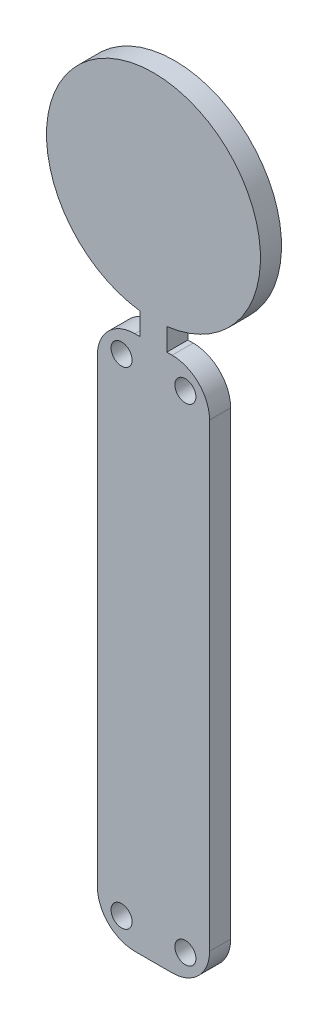
ISO-10303-21;
HEADER;
FILE_DESCRIPTION(('STEP AP214'),'2;1');
FILE_NAME('part.step','',(''),(''),'','','');
FILE_SCHEMA(('AUTOMOTIVE_DESIGN { 1 0 10303 214 1 1 1 1 }'));
ENDSEC;
DATA;
#1=APPLICATION_CONTEXT('core data for automotive mechanical design processes');
#2=APPLICATION_PROTOCOL_DEFINITION('international standard','automotive_design',2000,#1);
#3=PRODUCT_CONTEXT('',#1,'mechanical');
#4=PRODUCT('Part','Part','',(#3));
#5=PRODUCT_RELATED_PRODUCT_CATEGORY('part','',(#4));
#6=PRODUCT_DEFINITION_FORMATION('','',#4);
#7=PRODUCT_DEFINITION_CONTEXT('part definition',#1,'design');
#8=PRODUCT_DEFINITION('design','',#6,#7);
#9=PRODUCT_DEFINITION_SHAPE('','',#8);
#10=(LENGTH_UNIT() NAMED_UNIT(*) SI_UNIT(.MILLI.,.METRE.));
#11=(NAMED_UNIT(*) PLANE_ANGLE_UNIT() SI_UNIT($,.RADIAN.));
#12=(NAMED_UNIT(*) SI_UNIT($,.STERADIAN.) SOLID_ANGLE_UNIT());
#13=UNCERTAINTY_MEASURE_WITH_UNIT(LENGTH_MEASURE(1.E-05),#10,'distance_accuracy_value','');
#14=(GEOMETRIC_REPRESENTATION_CONTEXT(3) GLOBAL_UNCERTAINTY_ASSIGNED_CONTEXT((#13)) GLOBAL_UNIT_ASSIGNED_CONTEXT((#10,
#11,#12)) REPRESENTATION_CONTEXT('',''));
#15=CARTESIAN_POINT('',(0.,0.,0.));
#16=DIRECTION('',(0.,0.,1.));
#17=DIRECTION('',(1.,0.,0.));
#18=AXIS2_PLACEMENT_3D('',#15,#16,#17);
#19=CARTESIAN_POINT('',(-6.75698468233734,40.9643343229392,0.25));
#20=DIRECTION('',(0.,0.,-1.));
#21=DIRECTION('',(-1.,0.,0.));
#22=AXIS2_PLACEMENT_3D('',#19,#20,#21);
#23=CYLINDRICAL_SURFACE('',#22,2.53999999999997);
#24=CARTESIAN_POINT('',(-6.75698468233734,40.9643343229392,-0.25));
#25=DIRECTION('',(0.,0.,1.));
#26=DIRECTION('',(1.,0.,0.));
#27=AXIS2_PLACEMENT_3D('',#24,#25,#26);
#28=CIRCLE('',#27,2.53999999999997);
#29=CARTESIAN_POINT('',(-6.43948468233734,38.4442561991502,-0.25));
#30=VERTEX_POINT('',#29);
#31=CARTESIAN_POINT('',(-7.07448468233734,38.4442561991502,-0.25));
#32=VERTEX_POINT('',#31);
#33=EDGE_CURVE('E155',#30,#32,#28,.T.);
#34=ORIENTED_EDGE('',*,*,#33,.T.);
#35=DIRECTION('',(0.,0.,-1.));
#36=VECTOR('',#35,1.);
#37=CARTESIAN_POINT('',(-7.07448468233734,38.4442561991502,0.25));
#38=LINE('',#37,#36);
#39=CARTESIAN_POINT('',(-7.07448468233734,38.4442561991502,0.25));
#40=VERTEX_POINT('',#39);
#41=EDGE_CURVE('E11',#40,#32,#38,.T.);
#42=ORIENTED_EDGE('',*,*,#41,.F.);
#43=CARTESIAN_POINT('',(-6.75698468233734,40.9643343229392,0.25));
#44=DIRECTION('',(0.,0.,1.));
#45=DIRECTION('',(1.,0.,0.));
#46=AXIS2_PLACEMENT_3D('',#43,#44,#45);
#47=CIRCLE('',#46,2.53999999999997);
#48=CARTESIAN_POINT('',(-6.43948468233734,38.4442561991502,0.25));
#49=VERTEX_POINT('',#48);
#50=EDGE_CURVE('E177',#49,#40,#47,.T.);
#51=ORIENTED_EDGE('',*,*,#50,.F.);
#52=DIRECTION('',(0.,0.,-1.));
#53=VECTOR('',#52,1.);
#54=CARTESIAN_POINT('',(-6.43948468233734,38.4442561991502,0.25));
#55=LINE('',#54,#53);
#56=EDGE_CURVE('E151',#49,#30,#55,.T.);
#57=ORIENTED_EDGE('',*,*,#56,.T.);
#58=EDGE_LOOP('',(#34,#42,#51,#57));
#59=FACE_BOUND('',#58,.T.);
#60=ADVANCED_FACE('F33',(#59),#23,.T.);
#61=CARTESIAN_POINT('',(-7.07448468233734,38.4442561991502,0.25));
#62=DIRECTION('',(1.,0.,0.));
#63=DIRECTION('',(0.,0.,-1.));
#64=AXIS2_PLACEMENT_3D('',#61,#62,#63);
#65=PLANE('',#64);
#66=DIRECTION('',(0.,-1.,0.));
#67=VECTOR('',#66,1.);
#68=CARTESIAN_POINT('',(-7.07448468233734,38.4442561991502,-0.25));
#69=LINE('',#68,#67);
#70=CARTESIAN_POINT('',(-7.07448468233734,37.9163343229392,-0.25));
#71=VERTEX_POINT('',#70);
#72=EDGE_CURVE('E158',#32,#71,#69,.T.);
#73=ORIENTED_EDGE('',*,*,#72,.T.);
#74=DIRECTION('',(0.,0.,-1.));
#75=VECTOR('',#74,1.);
#76=CARTESIAN_POINT('',(-7.07448468233734,37.9163343229392,0.25));
#77=LINE('',#76,#75);
#78=CARTESIAN_POINT('',(-7.07448468233734,37.9163343229392,0.25));
#79=VERTEX_POINT('',#78);
#80=EDGE_CURVE('E42',#79,#71,#77,.T.);
#81=ORIENTED_EDGE('',*,*,#80,.F.);
#82=DIRECTION('',(0.,-1.,0.));
#83=VECTOR('',#82,1.);
#84=CARTESIAN_POINT('',(-7.07448468233734,38.4442561991502,0.25));
#85=LINE('',#84,#83);
#86=EDGE_CURVE('E106',#40,#79,#85,.T.);
#87=ORIENTED_EDGE('',*,*,#86,.F.);
#88=ORIENTED_EDGE('',*,*,#41,.T.);
#89=EDGE_LOOP('',(#73,#81,#87,#88));
#90=FACE_BOUND('',#89,.T.);
#91=ADVANCED_FACE('F230',(#90),#65,.F.);
#92=CARTESIAN_POINT('',(-7.07448468233734,37.9163343229392,0.25));
#93=DIRECTION('',(0.,-1.,0.));
#94=DIRECTION('',(0.,0.,-1.));
#95=AXIS2_PLACEMENT_3D('',#92,#93,#94);
#96=PLANE('',#95);
#97=DIRECTION('',(-1.,0.,0.));
#98=VECTOR('',#97,1.);
#99=CARTESIAN_POINT('',(-7.07448468233734,37.9163343229392,-0.25));
#100=LINE('',#99,#98);
#101=CARTESIAN_POINT('',(-7.20013304927737,37.9163343229392,-0.25));
#102=VERTEX_POINT('',#101);
#103=EDGE_CURVE('E160',#71,#102,#100,.T.);
#104=ORIENTED_EDGE('',*,*,#103,.T.);
#105=DIRECTION('',(0.,0.,-1.));
#106=VECTOR('',#105,1.);
#107=CARTESIAN_POINT('',(-7.20013304927737,37.9163343229392,0.25));
#108=LINE('',#107,#106);
#109=CARTESIAN_POINT('',(-7.20013304927737,37.9163343229392,0.25));
#110=VERTEX_POINT('',#109);
#111=EDGE_CURVE('E196',#110,#102,#108,.T.);
#112=ORIENTED_EDGE('',*,*,#111,.F.);
#113=DIRECTION('',(-1.,0.,0.));
#114=VECTOR('',#113,1.);
#115=CARTESIAN_POINT('',(-7.07448468233734,37.9163343229392,0.25));
#116=LINE('',#115,#114);
#117=EDGE_CURVE('E245',#79,#110,#116,.T.);
#118=ORIENTED_EDGE('',*,*,#117,.F.);
#119=ORIENTED_EDGE('',*,*,#80,.T.);
#120=EDGE_LOOP('',(#104,#112,#118,#119));
#121=FACE_BOUND('',#120,.T.);
#122=ADVANCED_FACE('F235',(#121),#96,.F.);
#123=CARTESIAN_POINT('',(-7.20013304927737,37.0273343229392,0.25));
#124=DIRECTION('',(0.,0.,-1.));
#125=DIRECTION('',(-1.,0.,0.));
#126=AXIS2_PLACEMENT_3D('',#123,#124,#125);
#127=CYLINDRICAL_SURFACE('',#126,0.889000000000001);
#128=CARTESIAN_POINT('',(-7.20013304927737,37.0273343229392,-0.25));
#129=DIRECTION('',(0.,0.,1.));
#130=DIRECTION('',(1.,0.,0.));
#131=AXIS2_PLACEMENT_3D('',#128,#129,#130);
#132=CIRCLE('',#131,0.889000000000001);
#133=CARTESIAN_POINT('',(-8.08913304927737,37.0273343229392,-0.25));
#134=VERTEX_POINT('',#133);
#135=EDGE_CURVE('E162',#102,#134,#132,.T.);
#136=ORIENTED_EDGE('',*,*,#135,.T.);
#137=DIRECTION('',(0.,0.,-1.));
#138=VECTOR('',#137,1.);
#139=CARTESIAN_POINT('',(-8.08913304927737,37.0273343229392,0.25));
#140=LINE('',#139,#138);
#141=CARTESIAN_POINT('',(-8.08913304927737,37.0273343229392,0.25));
#142=VERTEX_POINT('',#141);
#143=EDGE_CURVE('E193',#142,#134,#140,.T.);
#144=ORIENTED_EDGE('',*,*,#143,.F.);
#145=CARTESIAN_POINT('',(-7.20013304927737,37.0273343229392,0.25));
#146=DIRECTION('',(0.,0.,1.));
#147=DIRECTION('',(1.,0.,0.));
#148=AXIS2_PLACEMENT_3D('',#145,#146,#147);
#149=CIRCLE('',#148,0.889000000000001);
#150=EDGE_CURVE('E247',#110,#142,#149,.T.);
#151=ORIENTED_EDGE('',*,*,#150,.F.);
#152=ORIENTED_EDGE('',*,*,#111,.T.);
#153=EDGE_LOOP('',(#136,#144,#151,#152));
#154=FACE_BOUND('',#153,.T.);
#155=ADVANCED_FACE('F285',(#154),#127,.T.);
#156=CARTESIAN_POINT('',(-8.08913304927737,37.0273343229392,0.25));
#157=DIRECTION('',(1.,0.,0.));
#158=DIRECTION('',(0.,1.,0.));
#159=AXIS2_PLACEMENT_3D('',#156,#157,#158);
#160=PLANE('',#159);
#161=DIRECTION('',(0.,-1.,0.));
#162=VECTOR('',#161,1.);
#163=CARTESIAN_POINT('',(-8.08913304927737,37.0273343229392,-0.25));
#164=LINE('',#163,#162);
#165=CARTESIAN_POINT('',(-8.08913304927735,26.1053343229391,-0.25));
#166=VERTEX_POINT('',#165);
#167=EDGE_CURVE('E164',#134,#166,#164,.T.);
#168=ORIENTED_EDGE('',*,*,#167,.T.);
#169=DIRECTION('',(0.,0.,-1.));
#170=VECTOR('',#169,1.);
#171=CARTESIAN_POINT('',(-8.08913304927735,26.1053343229391,0.25));
#172=LINE('',#171,#170);
#173=CARTESIAN_POINT('',(-8.08913304927735,26.1053343229391,0.25));
#174=VERTEX_POINT('',#173);
#175=EDGE_CURVE('E190',#174,#166,#172,.T.);
#176=ORIENTED_EDGE('',*,*,#175,.F.);
#177=DIRECTION('',(0.,-1.,0.));
#178=VECTOR('',#177,1.);
#179=CARTESIAN_POINT('',(-8.08913304927737,37.0273343229392,0.25));
#180=LINE('',#179,#178);
#181=EDGE_CURVE('E249',#142,#174,#180,.T.);
#182=ORIENTED_EDGE('',*,*,#181,.F.);
#183=ORIENTED_EDGE('',*,*,#143,.T.);
#184=EDGE_LOOP('',(#168,#176,#182,#183));
#185=FACE_BOUND('',#184,.T.);
#186=ADVANCED_FACE('F282',(#185),#160,.F.);
#187=CARTESIAN_POINT('',(-7.20013304927734,26.1053343229391,0.25));
#188=DIRECTION('',(0.,0.,-1.));
#189=DIRECTION('',(-1.,0.,0.));
#190=AXIS2_PLACEMENT_3D('',#187,#188,#189);
#191=CYLINDRICAL_SURFACE('',#190,0.889000000000009);
#192=CARTESIAN_POINT('',(-7.20013304927734,26.1053343229391,-0.25));
#193=DIRECTION('',(0.,0.,1.));
#194=DIRECTION('',(1.,0.,0.));
#195=AXIS2_PLACEMENT_3D('',#192,#193,#194);
#196=CIRCLE('',#195,0.889000000000009);
#197=CARTESIAN_POINT('',(-7.20013304927734,25.2163343229391,-0.25));
#198=VERTEX_POINT('',#197);
#199=EDGE_CURVE('E166',#166,#198,#196,.T.);
#200=ORIENTED_EDGE('',*,*,#199,.T.);
#201=DIRECTION('',(0.,0.,-1.));
#202=VECTOR('',#201,1.);
#203=CARTESIAN_POINT('',(-7.20013304927734,25.2163343229391,0.25));
#204=LINE('',#203,#202);
#205=CARTESIAN_POINT('',(-7.20013304927734,25.2163343229391,0.25));
#206=VERTEX_POINT('',#205);
#207=EDGE_CURVE('E187',#206,#198,#204,.T.);
#208=ORIENTED_EDGE('',*,*,#207,.F.);
#209=CARTESIAN_POINT('',(-7.20013304927734,26.1053343229391,0.25));
#210=DIRECTION('',(0.,0.,1.));
#211=DIRECTION('',(1.,0.,0.));
#212=AXIS2_PLACEMENT_3D('',#209,#210,#211);
#213=CIRCLE('',#212,0.889000000000009);
#214=EDGE_CURVE('E255',#174,#206,#213,.T.);
#215=ORIENTED_EDGE('',*,*,#214,.F.);
#216=ORIENTED_EDGE('',*,*,#175,.T.);
#217=EDGE_LOOP('',(#200,#208,#215,#216));
#218=FACE_BOUND('',#217,.T.);
#219=ADVANCED_FACE('F278',(#218),#191,.T.);
#220=CARTESIAN_POINT('',(-7.20013304927734,25.2163343229391,0.25));
#221=DIRECTION('',(0.,1.,0.));
#222=DIRECTION('',(0.,0.,1.));
#223=AXIS2_PLACEMENT_3D('',#220,#221,#222);
#224=PLANE('',#223);
#225=DIRECTION('',(1.,0.,0.));
#226=VECTOR('',#225,1.);
#227=CARTESIAN_POINT('',(-7.20013304927734,25.2163343229391,-0.25));
#228=LINE('',#227,#226);
#229=CARTESIAN_POINT('',(-6.31383631539734,25.2163343229391,-0.25));
#230=VERTEX_POINT('',#229);
#231=EDGE_CURVE('E168',#198,#230,#228,.T.);
#232=ORIENTED_EDGE('',*,*,#231,.T.);
#233=DIRECTION('',(0.,0.,-1.));
#234=VECTOR('',#233,1.);
#235=CARTESIAN_POINT('',(-6.31383631539734,25.2163343229391,0.25));
#236=LINE('',#235,#234);
#237=CARTESIAN_POINT('',(-6.31383631539734,25.2163343229391,0.25));
#238=VERTEX_POINT('',#237);
#239=EDGE_CURVE('E184',#238,#230,#236,.T.);
#240=ORIENTED_EDGE('',*,*,#239,.F.);
#241=DIRECTION('',(1.,0.,0.));
#242=VECTOR('',#241,1.);
#243=CARTESIAN_POINT('',(-7.20013304927734,25.2163343229391,0.25));
#244=LINE('',#243,#242);
#245=EDGE_CURVE('E257',#206,#238,#244,.T.);
#246=ORIENTED_EDGE('',*,*,#245,.F.);
#247=ORIENTED_EDGE('',*,*,#207,.T.);
#248=EDGE_LOOP('',(#232,#240,#246,#247));
#249=FACE_BOUND('',#248,.T.);
#250=ADVANCED_FACE('F274',(#249),#224,.F.);
#251=CARTESIAN_POINT('',(-6.31383631539734,26.1053343229391,0.25));
#252=DIRECTION('',(0.,0.,-1.));
#253=DIRECTION('',(-1.,0.,0.));
#254=AXIS2_PLACEMENT_3D('',#251,#252,#253);
#255=CYLINDRICAL_SURFACE('',#254,0.889000000000009);
#256=CARTESIAN_POINT('',(-6.31383631539734,26.1053343229391,-0.25));
#257=DIRECTION('',(0.,0.,1.));
#258=DIRECTION('',(1.,0.,0.));
#259=AXIS2_PLACEMENT_3D('',#256,#257,#258);
#260=CIRCLE('',#259,0.889000000000009);
#261=CARTESIAN_POINT('',(-5.42483631539734,26.1053343229391,-0.25));
#262=VERTEX_POINT('',#261);
#263=EDGE_CURVE('E170',#230,#262,#260,.T.);
#264=ORIENTED_EDGE('',*,*,#263,.T.);
#265=DIRECTION('',(0.,0.,-1.));
#266=VECTOR('',#265,1.);
#267=CARTESIAN_POINT('',(-5.42483631539734,26.1053343229391,0.25));
#268=LINE('',#267,#266);
#269=CARTESIAN_POINT('',(-5.42483631539734,26.1053343229391,0.25));
#270=VERTEX_POINT('',#269);
#271=EDGE_CURVE('E181',#270,#262,#268,.T.);
#272=ORIENTED_EDGE('',*,*,#271,.F.);
#273=CARTESIAN_POINT('',(-6.31383631539734,26.1053343229391,0.25));
#274=DIRECTION('',(0.,0.,1.));
#275=DIRECTION('',(1.,0.,0.));
#276=AXIS2_PLACEMENT_3D('',#273,#274,#275);
#277=CIRCLE('',#276,0.889000000000009);
#278=EDGE_CURVE('E259',#238,#270,#277,.T.);
#279=ORIENTED_EDGE('',*,*,#278,.F.);
#280=ORIENTED_EDGE('',*,*,#239,.T.);
#281=EDGE_LOOP('',(#264,#272,#279,#280));
#282=FACE_BOUND('',#281,.T.);
#283=ADVANCED_FACE('F265',(#282),#255,.T.);
#284=CARTESIAN_POINT('',(-5.42483631539734,26.1053343229391,0.25));
#285=DIRECTION('',(-1.,0.,0.));
#286=DIRECTION('',(0.,0.,1.));
#287=AXIS2_PLACEMENT_3D('',#284,#285,#286);
#288=PLANE('',#287);
#289=DIRECTION('',(0.,1.,0.));
#290=VECTOR('',#289,1.);
#291=CARTESIAN_POINT('',(-5.42483631539734,26.1053343229391,-0.25));
#292=LINE('',#291,#290);
#293=CARTESIAN_POINT('',(-5.42483631539735,37.0273343229392,-0.25));
#294=VERTEX_POINT('',#293);
#295=EDGE_CURVE('E172',#262,#294,#292,.T.);
#296=ORIENTED_EDGE('',*,*,#295,.T.);
#297=DIRECTION('',(0.,0.,-1.));
#298=VECTOR('',#297,1.);
#299=CARTESIAN_POINT('',(-5.42483631539735,37.0273343229392,0.25));
#300=LINE('',#299,#298);
#301=CARTESIAN_POINT('',(-5.42483631539735,37.0273343229392,0.25));
#302=VERTEX_POINT('',#301);
#303=EDGE_CURVE('E146',#302,#294,#300,.T.);
#304=ORIENTED_EDGE('',*,*,#303,.F.);
#305=DIRECTION('',(0.,1.,0.));
#306=VECTOR('',#305,1.);
#307=CARTESIAN_POINT('',(-5.42483631539734,26.1053343229391,0.25));
#308=LINE('',#307,#306);
#309=EDGE_CURVE('E137',#270,#302,#308,.T.);
#310=ORIENTED_EDGE('',*,*,#309,.F.);
#311=ORIENTED_EDGE('',*,*,#271,.T.);
#312=EDGE_LOOP('',(#296,#304,#310,#311));
#313=FACE_BOUND('',#312,.T.);
#314=ADVANCED_FACE('F269',(#313),#288,.F.);
#315=CARTESIAN_POINT('',(-6.31383631539737,37.0273343229392,0.25));
#316=DIRECTION('',(0.,0.,-1.));
#317=DIRECTION('',(-1.,0.,0.));
#318=AXIS2_PLACEMENT_3D('',#315,#316,#317);
#319=CYLINDRICAL_SURFACE('',#318,0.889000000000015);
#320=CARTESIAN_POINT('',(-6.31383631539737,37.0273343229392,-0.25));
#321=DIRECTION('',(0.,0.,1.));
#322=DIRECTION('',(1.,0.,0.));
#323=AXIS2_PLACEMENT_3D('',#320,#321,#322);
#324=CIRCLE('',#323,0.889000000000015);
#325=CARTESIAN_POINT('',(-6.31383631539734,37.9163343229392,-0.25));
#326=VERTEX_POINT('',#325);
#327=EDGE_CURVE('E145',#294,#326,#324,.T.);
#328=ORIENTED_EDGE('',*,*,#327,.T.);
#329=DIRECTION('',(0.,0.,-1.));
#330=VECTOR('',#329,1.);
#331=CARTESIAN_POINT('',(-6.31383631539734,37.9163343229392,0.25));
#332=LINE('',#331,#330);
#333=CARTESIAN_POINT('',(-6.31383631539734,37.9163343229392,0.25));
#334=VERTEX_POINT('',#333);
#335=EDGE_CURVE('E142',#334,#326,#332,.T.);
#336=ORIENTED_EDGE('',*,*,#335,.F.);
#337=CARTESIAN_POINT('',(-6.31383631539737,37.0273343229392,0.25));
#338=DIRECTION('',(0.,0.,1.));
#339=DIRECTION('',(1.,0.,0.));
#340=AXIS2_PLACEMENT_3D('',#337,#338,#339);
#341=CIRCLE('',#340,0.889000000000015);
#342=EDGE_CURVE('E131',#302,#334,#341,.T.);
#343=ORIENTED_EDGE('',*,*,#342,.F.);
#344=ORIENTED_EDGE('',*,*,#303,.T.);
#345=EDGE_LOOP('',(#328,#336,#343,#344));
#346=FACE_BOUND('',#345,.T.);
#347=ADVANCED_FACE('F143',(#346),#319,.T.);
#348=CARTESIAN_POINT('',(-6.31383631539734,37.9163343229392,0.25));
#349=DIRECTION('',(0.,-1.,0.));
#350=DIRECTION('',(0.,0.,-1.));
#351=AXIS2_PLACEMENT_3D('',#348,#349,#350);
#352=PLANE('',#351);
#353=DIRECTION('',(-1.,0.,0.));
#354=VECTOR('',#353,1.);
#355=CARTESIAN_POINT('',(-6.31383631539734,37.9163343229392,-0.25));
#356=LINE('',#355,#354);
#357=CARTESIAN_POINT('',(-6.43948468233734,37.9163343229392,-0.25));
#358=VERTEX_POINT('',#357);
#359=EDGE_CURVE('E92',#326,#358,#356,.T.);
#360=ORIENTED_EDGE('',*,*,#359,.T.);
#361=DIRECTION('',(0.,0.,-1.));
#362=VECTOR('',#361,1.);
#363=CARTESIAN_POINT('',(-6.43948468233734,37.9163343229392,0.25));
#364=LINE('',#363,#362);
#365=CARTESIAN_POINT('',(-6.43948468233734,37.9163343229392,0.25));
#366=VERTEX_POINT('',#365);
#367=EDGE_CURVE('E147',#366,#358,#364,.T.);
#368=ORIENTED_EDGE('',*,*,#367,.F.);
#369=DIRECTION('',(-1.,0.,0.));
#370=VECTOR('',#369,1.);
#371=CARTESIAN_POINT('',(-6.31383631539734,37.9163343229392,0.25));
#372=LINE('',#371,#370);
#373=EDGE_CURVE('E135',#334,#366,#372,.T.);
#374=ORIENTED_EDGE('',*,*,#373,.F.);
#375=ORIENTED_EDGE('',*,*,#335,.T.);
#376=EDGE_LOOP('',(#360,#368,#374,#375));
#377=FACE_BOUND('',#376,.T.);
#378=ADVANCED_FACE('F149',(#377),#352,.F.);
#379=CARTESIAN_POINT('',(-6.43948468233734,37.9163343229392,0.25));
#380=DIRECTION('',(-1.,0.,0.));
#381=DIRECTION('',(0.,0.,1.));
#382=AXIS2_PLACEMENT_3D('',#379,#380,#381);
#383=PLANE('',#382);
#384=DIRECTION('',(0.,1.,0.));
#385=VECTOR('',#384,1.);
#386=CARTESIAN_POINT('',(-6.43948468233734,37.9163343229392,-0.25));
#387=LINE('',#386,#385);
#388=EDGE_CURVE('E98',#358,#30,#387,.T.);
#389=ORIENTED_EDGE('',*,*,#388,.T.);
#390=ORIENTED_EDGE('',*,*,#56,.F.);
#391=DIRECTION('',(0.,1.,0.));
#392=VECTOR('',#391,1.);
#393=CARTESIAN_POINT('',(-6.43948468233734,37.9163343229392,0.25));
#394=LINE('',#393,#392);
#395=EDGE_CURVE('E51',#366,#49,#394,.T.);
#396=ORIENTED_EDGE('',*,*,#395,.F.);
#397=ORIENTED_EDGE('',*,*,#367,.T.);
#398=EDGE_LOOP('',(#389,#390,#396,#397));
#399=FACE_BOUND('',#398,.T.);
#400=ADVANCED_FACE('F307',(#399),#383,.F.);
#401=CARTESIAN_POINT('',(-6.75698468233734,40.9643343229392,0.25));
#402=DIRECTION('',(0.,0.,1.));
#403=DIRECTION('',(1.,0.,0.));
#404=AXIS2_PLACEMENT_3D('',#401,#402,#403);
#405=PLANE('',#404);
#406=CARTESIAN_POINT('',(-5.99952735115993,25.7910253587017,0.25));
#407=DIRECTION('',(0.,0.,1.));
#408=DIRECTION('',(1.,0.,0.));
#409=AXIS2_PLACEMENT_3D('',#406,#407,#408);
#410=CIRCLE('',#409,0.25);
#411=CARTESIAN_POINT('',(-5.74952735115993,25.7910253587017,0.25));
#412=VERTEX_POINT('',#411);
#413=EDGE_CURVE('E328',#412,#412,#410,.T.);
#414=ORIENTED_EDGE('',*,*,#413,.F.);
#415=EDGE_LOOP('',(#414));
#416=FACE_BOUND('',#415,.T.);
#417=CARTESIAN_POINT('',(-7.51444201351477,37.3416432871765,0.25));
#418=DIRECTION('',(0.,0.,1.));
#419=DIRECTION('',(1.,0.,0.));
#420=AXIS2_PLACEMENT_3D('',#417,#418,#419);
#421=CIRCLE('',#420,0.25);
#422=CARTESIAN_POINT('',(-7.26444201351477,37.3416432871765,0.25));
#423=VERTEX_POINT('',#422);
#424=EDGE_CURVE('E330',#423,#423,#421,.T.);
#425=ORIENTED_EDGE('',*,*,#424,.F.);
#426=EDGE_LOOP('',(#425));
#427=FACE_BOUND('',#426,.T.);
#428=CARTESIAN_POINT('',(-5.99952735115993,37.3416432871765,0.25));
#429=DIRECTION('',(0.,0.,1.));
#430=DIRECTION('',(1.,0.,0.));
#431=AXIS2_PLACEMENT_3D('',#428,#429,#430);
#432=CIRCLE('',#431,0.25);
#433=CARTESIAN_POINT('',(-5.74952735115993,37.3416432871765,0.25));
#434=VERTEX_POINT('',#433);
#435=EDGE_CURVE('E334',#434,#434,#432,.T.);
#436=ORIENTED_EDGE('',*,*,#435,.F.);
#437=EDGE_LOOP('',(#436));
#438=FACE_BOUND('',#437,.T.);
#439=CARTESIAN_POINT('',(-7.51444201351477,25.7910253587017,0.25));
#440=DIRECTION('',(0.,0.,1.));
#441=DIRECTION('',(1.,0.,0.));
#442=AXIS2_PLACEMENT_3D('',#439,#440,#441);
#443=CIRCLE('',#442,0.25);
#444=CARTESIAN_POINT('',(-7.26444201351477,25.7910253587017,0.25));
#445=VERTEX_POINT('',#444);
#446=EDGE_CURVE('E205',#445,#445,#443,.T.);
#447=ORIENTED_EDGE('',*,*,#446,.F.);
#448=EDGE_LOOP('',(#447));
#449=FACE_BOUND('',#448,.T.);
#450=ORIENTED_EDGE('',*,*,#50,.T.);
#451=ORIENTED_EDGE('',*,*,#86,.T.);
#452=ORIENTED_EDGE('',*,*,#117,.T.);
#453=ORIENTED_EDGE('',*,*,#150,.T.);
#454=ORIENTED_EDGE('',*,*,#181,.T.);
#455=ORIENTED_EDGE('',*,*,#214,.T.);
#456=ORIENTED_EDGE('',*,*,#245,.T.);
#457=ORIENTED_EDGE('',*,*,#278,.T.);
#458=ORIENTED_EDGE('',*,*,#309,.T.);
#459=ORIENTED_EDGE('',*,*,#342,.T.);
#460=ORIENTED_EDGE('',*,*,#373,.T.);
#461=ORIENTED_EDGE('',*,*,#395,.T.);
#462=EDGE_LOOP('',(#450,#451,#452,#453,#454,#455,#456,#457,#458,#459,#460,#461));
#463=FACE_BOUND('',#462,.T.);
#464=ADVANCED_FACE('F133',(#416,#427,#438,#449,#463),#405,.T.);
#465=CARTESIAN_POINT('',(-6.75698468233734,40.9643343229392,-0.25));
#466=DIRECTION('',(0.,0.,1.));
#467=DIRECTION('',(1.,0.,0.));
#468=AXIS2_PLACEMENT_3D('',#465,#466,#467);
#469=PLANE('',#468);
#470=CARTESIAN_POINT('',(-5.99952735115993,25.7910253587017,-0.25));
#471=DIRECTION('',(0.,0.,1.));
#472=DIRECTION('',(1.,0.,0.));
#473=AXIS2_PLACEMENT_3D('',#470,#471,#472);
#474=CIRCLE('',#473,0.25);
#475=CARTESIAN_POINT('',(-5.74952735115993,25.7910253587017,-0.25));
#476=VERTEX_POINT('',#475);
#477=EDGE_CURVE('E36',#476,#476,#474,.T.);
#478=ORIENTED_EDGE('',*,*,#477,.T.);
#479=EDGE_LOOP('',(#478));
#480=FACE_BOUND('',#479,.T.);
#481=CARTESIAN_POINT('',(-7.51444201351477,37.3416432871765,-0.25));
#482=DIRECTION('',(0.,0.,1.));
#483=DIRECTION('',(1.,0.,0.));
#484=AXIS2_PLACEMENT_3D('',#481,#482,#483);
#485=CIRCLE('',#484,0.25);
#486=CARTESIAN_POINT('',(-7.26444201351477,37.3416432871765,-0.25));
#487=VERTEX_POINT('',#486);
#488=EDGE_CURVE('E207',#487,#487,#485,.T.);
#489=ORIENTED_EDGE('',*,*,#488,.T.);
#490=EDGE_LOOP('',(#489));
#491=FACE_BOUND('',#490,.T.);
#492=CARTESIAN_POINT('',(-5.99952735115993,37.3416432871765,-0.25));
#493=DIRECTION('',(0.,0.,1.));
#494=DIRECTION('',(1.,0.,0.));
#495=AXIS2_PLACEMENT_3D('',#492,#493,#494);
#496=CIRCLE('',#495,0.25);
#497=CARTESIAN_POINT('',(-5.74952735115993,37.3416432871765,-0.25));
#498=VERTEX_POINT('',#497);
#499=EDGE_CURVE('E204',#498,#498,#496,.T.);
#500=ORIENTED_EDGE('',*,*,#499,.T.);
#501=EDGE_LOOP('',(#500));
#502=FACE_BOUND('',#501,.T.);
#503=CARTESIAN_POINT('',(-7.51444201351477,25.7910253587017,-0.25));
#504=DIRECTION('',(0.,0.,1.));
#505=DIRECTION('',(1.,0.,0.));
#506=AXIS2_PLACEMENT_3D('',#503,#504,#505);
#507=CIRCLE('',#506,0.25);
#508=CARTESIAN_POINT('',(-7.26444201351477,25.7910253587017,-0.25));
#509=VERTEX_POINT('',#508);
#510=EDGE_CURVE('E201',#509,#509,#507,.T.);
#511=ORIENTED_EDGE('',*,*,#510,.T.);
#512=EDGE_LOOP('',(#511));
#513=FACE_BOUND('',#512,.T.);
#514=ORIENTED_EDGE('',*,*,#33,.F.);
#515=ORIENTED_EDGE('',*,*,#388,.F.);
#516=ORIENTED_EDGE('',*,*,#359,.F.);
#517=ORIENTED_EDGE('',*,*,#327,.F.);
#518=ORIENTED_EDGE('',*,*,#295,.F.);
#519=ORIENTED_EDGE('',*,*,#263,.F.);
#520=ORIENTED_EDGE('',*,*,#231,.F.);
#521=ORIENTED_EDGE('',*,*,#199,.F.);
#522=ORIENTED_EDGE('',*,*,#167,.F.);
#523=ORIENTED_EDGE('',*,*,#135,.F.);
#524=ORIENTED_EDGE('',*,*,#103,.F.);
#525=ORIENTED_EDGE('',*,*,#72,.F.);
#526=EDGE_LOOP('',(#514,#515,#516,#517,#518,#519,#520,#521,#522,#523,#524,#525));
#527=FACE_BOUND('',#526,.T.);
#528=ADVANCED_FACE('F214',(#480,#491,#502,#513,#527),#469,.F.);
#529=CARTESIAN_POINT('',(-7.51444201351477,25.7910253587017,-9.25));
#530=DIRECTION('',(0.,0.,1.));
#531=DIRECTION('',(1.,0.,0.));
#532=AXIS2_PLACEMENT_3D('',#529,#530,#531);
#533=CYLINDRICAL_SURFACE('',#532,0.25);
#534=ORIENTED_EDGE('',*,*,#446,.T.);
#535=EDGE_LOOP('',(#534));
#536=FACE_BOUND('',#535,.T.);
#537=ORIENTED_EDGE('',*,*,#510,.F.);
#538=EDGE_LOOP('',(#537));
#539=FACE_BOUND('',#538,.T.);
#540=ADVANCED_FACE('F312',(#536,#539),#533,.F.);
#541=CARTESIAN_POINT('',(-5.99952735115993,37.3416432871765,-9.25));
#542=DIRECTION('',(0.,0.,1.));
#543=DIRECTION('',(1.,0.,0.));
#544=AXIS2_PLACEMENT_3D('',#541,#542,#543);
#545=CYLINDRICAL_SURFACE('',#544,0.25);
#546=ORIENTED_EDGE('',*,*,#435,.T.);
#547=EDGE_LOOP('',(#546));
#548=FACE_BOUND('',#547,.T.);
#549=ORIENTED_EDGE('',*,*,#499,.F.);
#550=EDGE_LOOP('',(#549));
#551=FACE_BOUND('',#550,.T.);
#552=ADVANCED_FACE('F224',(#548,#551),#545,.F.);
#553=CARTESIAN_POINT('',(-7.51444201351477,37.3416432871765,-9.25));
#554=DIRECTION('',(0.,0.,1.));
#555=DIRECTION('',(1.,0.,0.));
#556=AXIS2_PLACEMENT_3D('',#553,#554,#555);
#557=CYLINDRICAL_SURFACE('',#556,0.25);
#558=ORIENTED_EDGE('',*,*,#424,.T.);
#559=EDGE_LOOP('',(#558));
#560=FACE_BOUND('',#559,.T.);
#561=ORIENTED_EDGE('',*,*,#488,.F.);
#562=EDGE_LOOP('',(#561));
#563=FACE_BOUND('',#562,.T.);
#564=ADVANCED_FACE('F218',(#560,#563),#557,.F.);
#565=CARTESIAN_POINT('',(-5.99952735115993,25.7910253587017,-9.25));
#566=DIRECTION('',(0.,0.,1.));
#567=DIRECTION('',(1.,0.,0.));
#568=AXIS2_PLACEMENT_3D('',#565,#566,#567);
#569=CYLINDRICAL_SURFACE('',#568,0.25);
#570=ORIENTED_EDGE('',*,*,#413,.T.);
#571=EDGE_LOOP('',(#570));
#572=FACE_BOUND('',#571,.T.);
#573=ORIENTED_EDGE('',*,*,#477,.F.);
#574=EDGE_LOOP('',(#573));
#575=FACE_BOUND('',#574,.T.);
#576=ADVANCED_FACE('F216',(#572,#575),#569,.F.);
#577=CLOSED_SHELL('',(#60,#91,#122,#155,#186,#219,#250,#283,#314,#347,#378,#400,#464,#528,#540,
#552,#564,#576));
#578=MANIFOLD_SOLID_BREP('B2',#577);
#579=ADVANCED_BREP_SHAPE_REPRESENTATION('',(#18,#578),#14);
#580=SHAPE_DEFINITION_REPRESENTATION(#9,#579);
ENDSEC;
END-ISO-10303-21;
